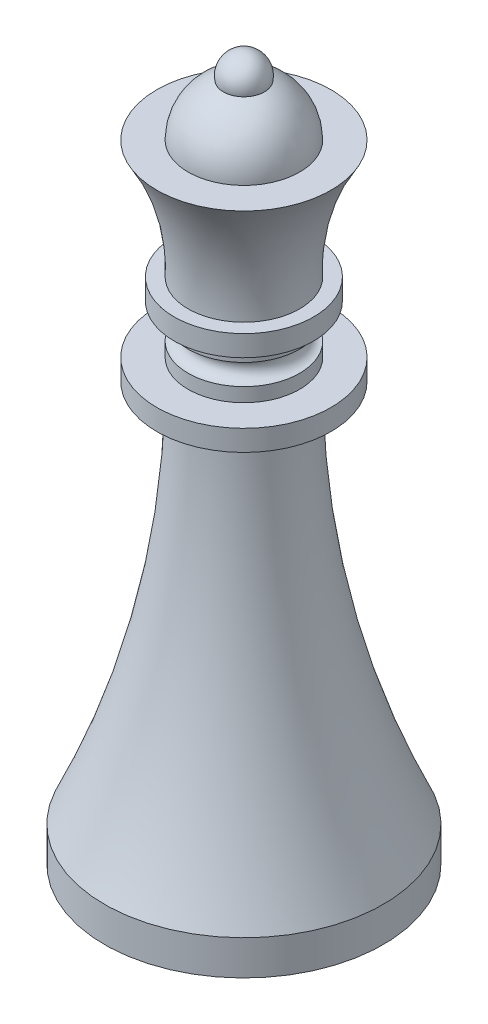
ISO-10303-21;
HEADER;
FILE_DESCRIPTION(('STEP AP214'),'2;1');
FILE_NAME('part.step','',(''),(''),'','','');
FILE_SCHEMA(('AUTOMOTIVE_DESIGN { 1 0 10303 214 1 1 1 1 }'));
ENDSEC;
DATA;
#1=APPLICATION_CONTEXT('core data for automotive mechanical design processes');
#2=APPLICATION_PROTOCOL_DEFINITION('international standard','automotive_design',2000,#1);
#3=PRODUCT_CONTEXT('',#1,'mechanical');
#4=PRODUCT('Part','Part','',(#3));
#5=PRODUCT_RELATED_PRODUCT_CATEGORY('part','',(#4));
#6=PRODUCT_DEFINITION_FORMATION('','',#4);
#7=PRODUCT_DEFINITION_CONTEXT('part definition',#1,'design');
#8=PRODUCT_DEFINITION('design','',#6,#7);
#9=PRODUCT_DEFINITION_SHAPE('','',#8);
#10=(LENGTH_UNIT() NAMED_UNIT(*) SI_UNIT(.MILLI.,.METRE.));
#11=(NAMED_UNIT(*) PLANE_ANGLE_UNIT() SI_UNIT($,.RADIAN.));
#12=(NAMED_UNIT(*) SI_UNIT($,.STERADIAN.) SOLID_ANGLE_UNIT());
#13=UNCERTAINTY_MEASURE_WITH_UNIT(LENGTH_MEASURE(1.E-05),#10,'distance_accuracy_value','');
#14=(GEOMETRIC_REPRESENTATION_CONTEXT(3) GLOBAL_UNCERTAINTY_ASSIGNED_CONTEXT((#13)) GLOBAL_UNIT_ASSIGNED_CONTEXT((#10,
#11,#12)) REPRESENTATION_CONTEXT('',''));
#15=CARTESIAN_POINT('',(0.,0.,0.));
#16=DIRECTION('',(0.,0.,1.));
#17=DIRECTION('',(1.,0.,0.));
#18=AXIS2_PLACEMENT_3D('',#15,#16,#17);
#19=CARTESIAN_POINT('',(0.,-36.,0.));
#20=DIRECTION('',(0.,1.,0.));
#21=DIRECTION('',(-1.,0.,0.));
#22=AXIS2_PLACEMENT_3D('',#19,#20,#21);
#23=PLANE('',#22);
#24=CARTESIAN_POINT('',(0.,-36.,0.));
#25=DIRECTION('',(0.,1.,0.));
#26=DIRECTION('',(-1.,0.,0.));
#27=AXIS2_PLACEMENT_3D('',#24,#25,#26);
#28=CIRCLE('',#27,12.);
#29=CARTESIAN_POINT('',(-12.,-36.,0.));
#30=VERTEX_POINT('',#29);
#31=EDGE_CURVE('E48',#30,#30,#28,.T.);
#32=ORIENTED_EDGE('',*,*,#31,.F.);
#33=EDGE_LOOP('',(#32));
#34=FACE_BOUND('',#33,.T.);
#35=ADVANCED_FACE('F37',(#34),#23,.F.);
#36=CARTESIAN_POINT('',(0.,30.,0.));
#37=DIRECTION('',(0.,1.,0.));
#38=DIRECTION('',(-1.,0.,0.));
#39=AXIS2_PLACEMENT_3D('',#36,#37,#38);
#40=CYLINDRICAL_SURFACE('',#39,12.);
#41=CARTESIAN_POINT('',(0.,-33.,0.));
#42=DIRECTION('',(0.,1.,0.));
#43=DIRECTION('',(-1.,0.,0.));
#44=AXIS2_PLACEMENT_3D('',#41,#42,#43);
#45=CIRCLE('',#44,12.);
#46=CARTESIAN_POINT('',(-12.,-33.,0.));
#47=VERTEX_POINT('',#46);
#48=EDGE_CURVE('E52',#47,#47,#45,.T.);
#49=ORIENTED_EDGE('',*,*,#48,.F.);
#50=EDGE_LOOP('',(#49));
#51=FACE_BOUND('',#50,.T.);
#52=ORIENTED_EDGE('',*,*,#31,.T.);
#53=EDGE_LOOP('',(#52));
#54=FACE_BOUND('',#53,.T.);
#55=ADVANCED_FACE('F169',(#51,#54),#40,.T.);
#56=CARTESIAN_POINT('',(0.,0.,0.));
#57=DIRECTION('',(0.,1.,0.));
#58=DIRECTION('',(-1.,0.,0.));
#59=AXIS2_PLACEMENT_3D('',#56,#57,#58);
#60=TOROIDAL_SURFACE('',#59,84.0249999999997,79.2249999999997);
#61=CARTESIAN_POINT('',(0.,-1.21845562319769,0.));
#62=DIRECTION('',(0.,1.,0.));
#63=DIRECTION('',(-1.,0.,0.));
#64=AXIS2_PLACEMENT_3D('',#61,#62,#63);
#65=CIRCLE('',#64,4.80937028657602);
#66=CARTESIAN_POINT('',(-4.80937028657602,-1.21845562319769,0.));
#67=VERTEX_POINT('',#66);
#68=EDGE_CURVE('E10',#67,#67,#65,.F.);
#69=ORIENTED_EDGE('',*,*,#68,.T.);
#70=EDGE_LOOP('',(#69));
#71=FACE_BOUND('',#70,.T.);
#72=ORIENTED_EDGE('',*,*,#48,.T.);
#73=EDGE_LOOP('',(#72));
#74=FACE_BOUND('',#73,.T.);
#75=ADVANCED_FACE('F164',(#71,#74),#60,.F.);
#76=CARTESIAN_POINT('',(4.8,0.,0.));
#77=DIRECTION('',(0.,1.,0.));
#78=DIRECTION('',(-1.,0.,0.));
#79=AXIS2_PLACEMENT_3D('',#76,#77,#78);
#80=PLANE('',#79);
#81=CARTESIAN_POINT('',(0.,0.,0.));
#82=DIRECTION('',(0.,1.,0.));
#83=DIRECTION('',(-1.,0.,0.));
#84=AXIS2_PLACEMENT_3D('',#81,#82,#83);
#85=CIRCLE('',#84,6.00922835733789);
#86=CARTESIAN_POINT('',(-6.00922835733789,0.,0.));
#87=VERTEX_POINT('',#86);
#88=EDGE_CURVE('E44',#87,#87,#85,.T.);
#89=ORIENTED_EDGE('',*,*,#88,.T.);
#90=EDGE_LOOP('',(#89));
#91=FACE_BOUND('',#90,.T.);
#92=CARTESIAN_POINT('',(0.,0.,0.));
#93=DIRECTION('',(0.,1.,0.));
#94=DIRECTION('',(-1.,0.,0.));
#95=AXIS2_PLACEMENT_3D('',#92,#93,#94);
#96=CIRCLE('',#95,7.5);
#97=CARTESIAN_POINT('',(-7.49999999999999,0.,0.));
#98=VERTEX_POINT('',#97);
#99=EDGE_CURVE('E57',#98,#98,#96,.T.);
#100=ORIENTED_EDGE('',*,*,#99,.F.);
#101=EDGE_LOOP('',(#100));
#102=FACE_BOUND('',#101,.T.);
#103=ADVANCED_FACE('F159',(#91,#102),#80,.F.);
#104=CARTESIAN_POINT('',(0.,30.,0.));
#105=DIRECTION('',(0.,1.,0.));
#106=DIRECTION('',(-1.,0.,0.));
#107=AXIS2_PLACEMENT_3D('',#104,#105,#106);
#108=CYLINDRICAL_SURFACE('',#107,7.5);
#109=CARTESIAN_POINT('',(0.,1.8,0.));
#110=DIRECTION('',(0.,1.,0.));
#111=DIRECTION('',(-1.,0.,0.));
#112=AXIS2_PLACEMENT_3D('',#109,#110,#111);
#113=CIRCLE('',#112,7.5);
#114=CARTESIAN_POINT('',(-7.5,1.8,0.));
#115=VERTEX_POINT('',#114);
#116=EDGE_CURVE('E60',#115,#115,#113,.T.);
#117=ORIENTED_EDGE('',*,*,#116,.F.);
#118=EDGE_LOOP('',(#117));
#119=FACE_BOUND('',#118,.T.);
#120=ORIENTED_EDGE('',*,*,#99,.T.);
#121=EDGE_LOOP('',(#120));
#122=FACE_BOUND('',#121,.T.);
#123=ADVANCED_FACE('F153',(#119,#122),#108,.T.);
#124=CARTESIAN_POINT('',(7.5,1.8,0.));
#125=DIRECTION('',(0.,-1.,0.));
#126=DIRECTION('',(1.,0.,0.));
#127=AXIS2_PLACEMENT_3D('',#124,#125,#126);
#128=PLANE('',#127);
#129=CARTESIAN_POINT('',(0.,1.8,0.));
#130=DIRECTION('',(0.,1.,0.));
#131=DIRECTION('',(-1.,0.,0.));
#132=AXIS2_PLACEMENT_3D('',#129,#130,#131);
#133=CIRCLE('',#132,4.8);
#134=CARTESIAN_POINT('',(-4.8,1.8,0.));
#135=VERTEX_POINT('',#134);
#136=EDGE_CURVE('E63',#135,#135,#133,.T.);
#137=ORIENTED_EDGE('',*,*,#136,.F.);
#138=EDGE_LOOP('',(#137));
#139=FACE_BOUND('',#138,.T.);
#140=ORIENTED_EDGE('',*,*,#116,.T.);
#141=EDGE_LOOP('',(#140));
#142=FACE_BOUND('',#141,.T.);
#143=ADVANCED_FACE('F147',(#139,#142),#128,.F.);
#144=CARTESIAN_POINT('',(0.,30.,0.));
#145=DIRECTION('',(0.,1.,0.));
#146=DIRECTION('',(-1.,0.,0.));
#147=AXIS2_PLACEMENT_3D('',#144,#145,#146);
#148=CYLINDRICAL_SURFACE('',#147,4.8);
#149=CARTESIAN_POINT('',(0.,3.,0.));
#150=DIRECTION('',(0.,1.,0.));
#151=DIRECTION('',(-1.,0.,0.));
#152=AXIS2_PLACEMENT_3D('',#149,#150,#151);
#153=CIRCLE('',#152,4.8);
#154=CARTESIAN_POINT('',(-4.8,3.,0.));
#155=VERTEX_POINT('',#154);
#156=EDGE_CURVE('E66',#155,#155,#153,.T.);
#157=ORIENTED_EDGE('',*,*,#156,.F.);
#158=EDGE_LOOP('',(#157));
#159=FACE_BOUND('',#158,.T.);
#160=ORIENTED_EDGE('',*,*,#136,.T.);
#161=EDGE_LOOP('',(#160));
#162=FACE_BOUND('',#161,.T.);
#163=ADVANCED_FACE('F141',(#159,#162),#148,.T.);
#164=CARTESIAN_POINT('',(0.,3.9,0.));
#165=DIRECTION('',(0.,1.,0.));
#166=DIRECTION('',(-1.,0.,0.));
#167=AXIS2_PLACEMENT_3D('',#164,#165,#166);
#168=TOROIDAL_SURFACE('',#167,4.8,0.9);
#169=CARTESIAN_POINT('',(0.,4.8,0.));
#170=DIRECTION('',(0.,1.,0.));
#171=DIRECTION('',(-1.,0.,0.));
#172=AXIS2_PLACEMENT_3D('',#169,#170,#171);
#173=CIRCLE('',#172,4.8);
#174=CARTESIAN_POINT('',(-4.8,4.8,0.));
#175=VERTEX_POINT('',#174);
#176=EDGE_CURVE('E69',#175,#175,#173,.T.);
#177=ORIENTED_EDGE('',*,*,#176,.F.);
#178=EDGE_LOOP('',(#177));
#179=FACE_BOUND('',#178,.T.);
#180=ORIENTED_EDGE('',*,*,#156,.T.);
#181=EDGE_LOOP('',(#180));
#182=FACE_BOUND('',#181,.T.);
#183=ADVANCED_FACE('F135',(#179,#182),#168,.F.);
#184=CARTESIAN_POINT('',(0.,30.,0.));
#185=DIRECTION('',(0.,1.,0.));
#186=DIRECTION('',(-1.,0.,0.));
#187=AXIS2_PLACEMENT_3D('',#184,#185,#186);
#188=CYLINDRICAL_SURFACE('',#187,4.8);
#189=CARTESIAN_POINT('',(0.,6.,0.));
#190=DIRECTION('',(0.,1.,0.));
#191=DIRECTION('',(-1.,0.,0.));
#192=AXIS2_PLACEMENT_3D('',#189,#190,#191);
#193=CIRCLE('',#192,4.8);
#194=CARTESIAN_POINT('',(-4.8,6.,0.));
#195=VERTEX_POINT('',#194);
#196=EDGE_CURVE('E72',#195,#195,#193,.T.);
#197=ORIENTED_EDGE('',*,*,#196,.F.);
#198=EDGE_LOOP('',(#197));
#199=FACE_BOUND('',#198,.T.);
#200=ORIENTED_EDGE('',*,*,#176,.T.);
#201=EDGE_LOOP('',(#200));
#202=FACE_BOUND('',#201,.T.);
#203=ADVANCED_FACE('F129',(#199,#202),#188,.T.);
#204=CARTESIAN_POINT('',(6.,6.,0.));
#205=DIRECTION('',(0.,1.,0.));
#206=DIRECTION('',(-1.,0.,0.));
#207=AXIS2_PLACEMENT_3D('',#204,#205,#206);
#208=PLANE('',#207);
#209=CARTESIAN_POINT('',(0.,6.,0.));
#210=DIRECTION('',(0.,1.,0.));
#211=DIRECTION('',(-1.,0.,0.));
#212=AXIS2_PLACEMENT_3D('',#209,#210,#211);
#213=CIRCLE('',#212,6.);
#214=CARTESIAN_POINT('',(-5.99999999999999,6.,0.));
#215=VERTEX_POINT('',#214);
#216=EDGE_CURVE('E75',#215,#215,#213,.T.);
#217=ORIENTED_EDGE('',*,*,#216,.F.);
#218=EDGE_LOOP('',(#217));
#219=FACE_BOUND('',#218,.T.);
#220=ORIENTED_EDGE('',*,*,#196,.T.);
#221=EDGE_LOOP('',(#220));
#222=FACE_BOUND('',#221,.T.);
#223=ADVANCED_FACE('F123',(#219,#222),#208,.F.);
#224=CARTESIAN_POINT('',(0.,30.,0.));
#225=DIRECTION('',(0.,1.,0.));
#226=DIRECTION('',(-1.,0.,0.));
#227=AXIS2_PLACEMENT_3D('',#224,#225,#226);
#228=CYLINDRICAL_SURFACE('',#227,6.);
#229=CARTESIAN_POINT('',(0.,7.8,0.));
#230=DIRECTION('',(0.,1.,0.));
#231=DIRECTION('',(-1.,0.,0.));
#232=AXIS2_PLACEMENT_3D('',#229,#230,#231);
#233=CIRCLE('',#232,6.);
#234=CARTESIAN_POINT('',(-6.,7.8,0.));
#235=VERTEX_POINT('',#234);
#236=EDGE_CURVE('E78',#235,#235,#233,.T.);
#237=ORIENTED_EDGE('',*,*,#236,.F.);
#238=EDGE_LOOP('',(#237));
#239=FACE_BOUND('',#238,.T.);
#240=ORIENTED_EDGE('',*,*,#216,.T.);
#241=EDGE_LOOP('',(#240));
#242=FACE_BOUND('',#241,.T.);
#243=ADVANCED_FACE('F117',(#239,#242),#228,.T.);
#244=CARTESIAN_POINT('',(4.8,7.8,0.));
#245=DIRECTION('',(0.,-1.,0.));
#246=DIRECTION('',(1.,0.,0.));
#247=AXIS2_PLACEMENT_3D('',#244,#245,#246);
#248=PLANE('',#247);
#249=CARTESIAN_POINT('',(0.,7.8,0.));
#250=DIRECTION('',(0.,1.,0.));
#251=DIRECTION('',(-1.,0.,0.));
#252=AXIS2_PLACEMENT_3D('',#249,#250,#251);
#253=CIRCLE('',#252,4.8);
#254=CARTESIAN_POINT('',(-4.8,7.8,0.));
#255=VERTEX_POINT('',#254);
#256=EDGE_CURVE('E81',#255,#255,#253,.T.);
#257=ORIENTED_EDGE('',*,*,#256,.F.);
#258=EDGE_LOOP('',(#257));
#259=FACE_BOUND('',#258,.T.);
#260=ORIENTED_EDGE('',*,*,#236,.T.);
#261=EDGE_LOOP('',(#260));
#262=FACE_BOUND('',#261,.T.);
#263=ADVANCED_FACE('F111',(#259,#262),#248,.F.);
#264=CARTESIAN_POINT('',(0.,8.49621244997308,0.));
#265=DIRECTION('',(0.,1.,0.));
#266=DIRECTION('',(-1.,0.,0.));
#267=AXIS2_PLACEMENT_3D('',#264,#265,#266);
#268=TOROIDAL_SURFACE('',#267,22.7865307445461,18.);
#269=CARTESIAN_POINT('',(0.,18.,0.));
#270=DIRECTION('',(0.,1.,0.));
#271=DIRECTION('',(-1.,0.,0.));
#272=AXIS2_PLACEMENT_3D('',#269,#270,#271);
#273=CIRCLE('',#272,7.5);
#274=CARTESIAN_POINT('',(-7.5,18.,0.));
#275=VERTEX_POINT('',#274);
#276=EDGE_CURVE('E84',#275,#275,#273,.T.);
#277=ORIENTED_EDGE('',*,*,#276,.F.);
#278=EDGE_LOOP('',(#277));
#279=FACE_BOUND('',#278,.T.);
#280=ORIENTED_EDGE('',*,*,#256,.T.);
#281=EDGE_LOOP('',(#280));
#282=FACE_BOUND('',#281,.T.);
#283=ADVANCED_FACE('F105',(#279,#282),#268,.F.);
#284=CARTESIAN_POINT('',(4.8,18.,0.));
#285=DIRECTION('',(0.,-1.,0.));
#286=DIRECTION('',(1.,0.,0.));
#287=AXIS2_PLACEMENT_3D('',#284,#285,#286);
#288=PLANE('',#287);
#289=CARTESIAN_POINT('',(0.,18.,0.));
#290=DIRECTION('',(0.,1.,0.));
#291=DIRECTION('',(-1.,0.,0.));
#292=AXIS2_PLACEMENT_3D('',#289,#290,#291);
#293=CIRCLE('',#292,4.8);
#294=CARTESIAN_POINT('',(-4.8,18.,0.));
#295=VERTEX_POINT('',#294);
#296=EDGE_CURVE('E87',#295,#295,#293,.T.);
#297=ORIENTED_EDGE('',*,*,#296,.F.);
#298=EDGE_LOOP('',(#297));
#299=FACE_BOUND('',#298,.T.);
#300=ORIENTED_EDGE('',*,*,#276,.T.);
#301=EDGE_LOOP('',(#300));
#302=FACE_BOUND('',#301,.T.);
#303=ADVANCED_FACE('F99',(#299,#302),#288,.F.);
#304=CARTESIAN_POINT('',(0.,18.,0.));
#305=DIRECTION('',(0.,1.,0.));
#306=DIRECTION('',(1.,0.,0.));
#307=AXIS2_PLACEMENT_3D('',#304,#305,#306);
#308=SPHERICAL_SURFACE('',#307,4.8);
#309=CARTESIAN_POINT('',(0.,22.4625,0.));
#310=DIRECTION('',(0.,1.,0.));
#311=DIRECTION('',(-1.,0.,0.));
#312=AXIS2_PLACEMENT_3D('',#309,#310,#311);
#313=CIRCLE('',#312,1.76807628511894);
#314=CARTESIAN_POINT('',(-1.76807628511894,22.4625,0.));
#315=VERTEX_POINT('',#314);
#316=EDGE_CURVE('E90',#315,#315,#313,.T.);
#317=ORIENTED_EDGE('',*,*,#316,.F.);
#318=EDGE_LOOP('',(#317));
#319=FACE_BOUND('',#318,.T.);
#320=ORIENTED_EDGE('',*,*,#296,.T.);
#321=EDGE_LOOP('',(#320));
#322=FACE_BOUND('',#321,.T.);
#323=ADVANCED_FACE('F96',(#319,#322),#308,.T.);
#324=CARTESIAN_POINT('',(0.,22.8,0.));
#325=DIRECTION('',(0.,1.,0.));
#326=DIRECTION('',(1.,0.,0.));
#327=AXIS2_PLACEMENT_3D('',#324,#325,#326);
#328=SPHERICAL_SURFACE('',#327,1.8);
#329=ORIENTED_EDGE('',*,*,#316,.T.);
#330=EDGE_LOOP('',(#329));
#331=FACE_BOUND('',#330,.T.);
#332=ADVANCED_FACE('F94',(#331),#328,.T.);
#333=CARTESIAN_POINT('',(0.,-1.2,0.));
#334=DIRECTION('',(0.,-1.,0.));
#335=DIRECTION('',(1.,0.,0.));
#336=AXIS2_PLACEMENT_3D('',#333,#334,#335);
#337=TOROIDAL_SURFACE('',#336,6.00922835733789,1.2);
#338=ORIENTED_EDGE('',*,*,#68,.F.);
#339=EDGE_LOOP('',(#338));
#340=FACE_BOUND('',#339,.T.);
#341=ORIENTED_EDGE('',*,*,#88,.F.);
#342=EDGE_LOOP('',(#341));
#343=FACE_BOUND('',#342,.T.);
#344=ADVANCED_FACE('F39',(#340,#343),#337,.F.);
#345=CLOSED_SHELL('',(#35,#55,#75,#103,#123,#143,#163,#183,#203,#223,#243,#263,#283,#303,#323,
#332,#344));
#346=MANIFOLD_SOLID_BREP('B2',#345);
#347=ADVANCED_BREP_SHAPE_REPRESENTATION('',(#18,#346),#14);
#348=SHAPE_DEFINITION_REPRESENTATION(#9,#347);
ENDSEC;
END-ISO-10303-21;
